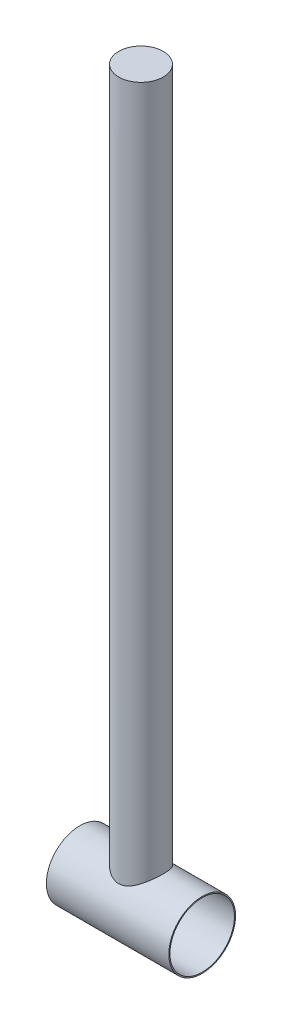
ISO-10303-21;
HEADER;
FILE_DESCRIPTION(('STEP AP214'),'2;1');
FILE_NAME('part.step','',(''),(''),'','','');
FILE_SCHEMA(('AUTOMOTIVE_DESIGN { 1 0 10303 214 1 1 1 1 }'));
ENDSEC;
DATA;
#1=APPLICATION_CONTEXT('core data for automotive mechanical design processes');
#2=APPLICATION_PROTOCOL_DEFINITION('international standard','automotive_design',2000,#1);
#3=PRODUCT_CONTEXT('',#1,'mechanical');
#4=PRODUCT('Part','Part','',(#3));
#5=PRODUCT_RELATED_PRODUCT_CATEGORY('part','',(#4));
#6=PRODUCT_DEFINITION_FORMATION('','',#4);
#7=PRODUCT_DEFINITION_CONTEXT('part definition',#1,'design');
#8=PRODUCT_DEFINITION('design','',#6,#7);
#9=PRODUCT_DEFINITION_SHAPE('','',#8);
#10=(LENGTH_UNIT() NAMED_UNIT(*) SI_UNIT(.MILLI.,.METRE.));
#11=(NAMED_UNIT(*) PLANE_ANGLE_UNIT() SI_UNIT($,.RADIAN.));
#12=(NAMED_UNIT(*) SI_UNIT($,.STERADIAN.) SOLID_ANGLE_UNIT());
#13=UNCERTAINTY_MEASURE_WITH_UNIT(LENGTH_MEASURE(1.E-05),#10,'distance_accuracy_value','');
#14=(GEOMETRIC_REPRESENTATION_CONTEXT(3) GLOBAL_UNCERTAINTY_ASSIGNED_CONTEXT((#13)) GLOBAL_UNIT_ASSIGNED_CONTEXT((#10,
#11,#12)) REPRESENTATION_CONTEXT('',''));
#15=CARTESIAN_POINT('',(0.,0.,0.));
#16=DIRECTION('',(0.,0.,1.));
#17=DIRECTION('',(1.,0.,0.));
#18=AXIS2_PLACEMENT_3D('',#15,#16,#17);
#19=CARTESIAN_POINT('',(55.,0.,0.));
#20=DIRECTION('',(1.,0.,0.));
#21=DIRECTION('',(0.,0.,-1.));
#22=AXIS2_PLACEMENT_3D('',#19,#20,#21);
#23=PLANE('',#22);
#24=CARTESIAN_POINT('',(55.,0.,0.));
#25=DIRECTION('',(1.,0.,0.));
#26=DIRECTION('',(0.,0.,-1.));
#27=AXIS2_PLACEMENT_3D('',#24,#25,#26);
#28=CIRCLE('',#27,30.);
#29=CARTESIAN_POINT('',(55.,0.,-30.));
#30=VERTEX_POINT('',#29);
#31=EDGE_CURVE('E10',#30,#30,#28,.T.);
#32=ORIENTED_EDGE('',*,*,#31,.T.);
#33=EDGE_LOOP('',(#32));
#34=FACE_BOUND('',#33,.T.);
#35=CARTESIAN_POINT('',(55.,0.,0.));
#36=DIRECTION('',(1.,0.,0.));
#37=DIRECTION('',(0.,0.,-1.));
#38=AXIS2_PLACEMENT_3D('',#35,#36,#37);
#39=CIRCLE('',#38,29.);
#40=CARTESIAN_POINT('',(55.,0.,-29.));
#41=VERTEX_POINT('',#40);
#42=EDGE_CURVE('E41',#41,#41,#39,.T.);
#43=ORIENTED_EDGE('',*,*,#42,.F.);
#44=EDGE_LOOP('',(#43));
#45=FACE_BOUND('',#44,.T.);
#46=ADVANCED_FACE('F30',(#34,#45),#23,.T.);
#47=CARTESIAN_POINT('',(-55.,0.,0.));
#48=DIRECTION('',(1.,0.,0.));
#49=DIRECTION('',(0.,0.,-1.));
#50=AXIS2_PLACEMENT_3D('',#47,#48,#49);
#51=PLANE('',#50);
#52=CARTESIAN_POINT('',(-55.,0.,0.));
#53=DIRECTION('',(1.,0.,0.));
#54=DIRECTION('',(0.,0.,-1.));
#55=AXIS2_PLACEMENT_3D('',#52,#53,#54);
#56=CIRCLE('',#55,30.);
#57=CARTESIAN_POINT('',(-55.,0.,-30.));
#58=VERTEX_POINT('',#57);
#59=EDGE_CURVE('E34',#58,#58,#56,.T.);
#60=ORIENTED_EDGE('',*,*,#59,.F.);
#61=EDGE_LOOP('',(#60));
#62=FACE_BOUND('',#61,.T.);
#63=CARTESIAN_POINT('',(-55.,0.,0.));
#64=DIRECTION('',(1.,0.,0.));
#65=DIRECTION('',(0.,0.,-1.));
#66=AXIS2_PLACEMENT_3D('',#63,#64,#65);
#67=CIRCLE('',#66,29.);
#68=CARTESIAN_POINT('',(-55.,0.,-29.));
#69=VERTEX_POINT('',#68);
#70=EDGE_CURVE('E43',#69,#69,#67,.T.);
#71=ORIENTED_EDGE('',*,*,#70,.T.);
#72=EDGE_LOOP('',(#71));
#73=FACE_BOUND('',#72,.T.);
#74=ADVANCED_FACE('F73',(#62,#73),#51,.F.);
#75=CARTESIAN_POINT('',(55.,0.,0.));
#76=DIRECTION('',(-1.,0.,0.));
#77=DIRECTION('',(0.,0.,1.));
#78=AXIS2_PLACEMENT_3D('',#75,#76,#77);
#79=CYLINDRICAL_SURFACE('',#78,30.);
#80=CARTESIAN_POINT('',(0.,22.3606797749979,20.));
#81=CARTESIAN_POINT('',(0.488208956169302,22.3606858935288,19.9999964119226));
#82=CARTESIAN_POINT('',(0.976468291774057,22.3767415723571,19.9820866285813));
#83=CARTESIAN_POINT('',(1.94835881250643,22.4401594085095,19.9108373861768));
#84=CARTESIAN_POINT('',(2.43198924712352,22.4875265581483,19.8574922772833));
#85=CARTESIAN_POINT('',(3.39112332136817,22.6113496939203,19.7163799196857));
#86=CARTESIAN_POINT('',(3.8666135294044,22.6878496694561,19.6285606101056));
#87=CARTESIAN_POINT('',(4.80533737323533,22.8665434498395,19.4200919600602));
#88=CARTESIAN_POINT('',(5.26857077190595,22.9687377513765,19.2994419849513));
#89=CARTESIAN_POINT('',(6.17578513914899,23.193728226989,19.0284426273943));
#90=CARTESIAN_POINT('',(6.61991112961049,23.3163108203906,18.8783985352891));
#91=CARTESIAN_POINT('',(7.49212487931456,23.5787801839215,18.5495380856481));
#92=CARTESIAN_POINT('',(7.92020999413461,23.7186697909934,18.3707170095788));
#93=CARTESIAN_POINT('',(8.75912421482543,24.0118255935988,17.9858478768931));
#94=CARTESIAN_POINT('',(9.16995442032432,24.1650909347959,17.7798015587787));
#95=CARTESIAN_POINT('',(9.97362051230804,24.4813525241294,17.3417522052945));
#96=CARTESIAN_POINT('',(10.3664551510918,24.644349445194,17.1097473739498));
#97=CARTESIAN_POINT('',(11.1932268211757,25.00257367896,16.5827611461459));
#98=CARTESIAN_POINT('',(11.6240409428177,25.1988679806497,16.2835985891376));
#99=CARTESIAN_POINT('',(12.4598274059487,25.5951544496233,15.6533280846079));
#100=CARTESIAN_POINT('',(12.8647979980787,25.7951468660549,15.3222179783466));
#101=CARTESIAN_POINT('',(13.6481434866574,26.194621993879,14.6288076134715));
#102=CARTESIAN_POINT('',(14.0264936382841,26.3941040691864,14.2664790139786));
#103=CARTESIAN_POINT('',(14.7548145893199,26.788258639696,13.5118632099609));
#104=CARTESIAN_POINT('',(15.1047834311923,26.9829308025026,13.1195739425843));
#105=CARTESIAN_POINT('',(15.8231340954399,27.3910931463656,12.2471310095378));
#106=CARTESIAN_POINT('',(16.1868495528045,27.6032288530363,11.7624780965832));
#107=CARTESIAN_POINT('',(16.8717372344808,28.0103500677694,10.7570654072488));
#108=CARTESIAN_POINT('',(17.1929043262227,28.2053335058183,10.2363012863295));
#109=CARTESIAN_POINT('',(17.7887598687195,28.5724511444835,9.16171847148811));
#110=CARTESIAN_POINT('',(18.0634871779264,28.7446044219641,8.60792794262455));
#111=CARTESIAN_POINT('',(18.5627727588207,29.0609568759301,7.47053849984761));
#112=CARTESIAN_POINT('',(18.7873417767955,29.205162039351,6.88694600391359));
#113=CARTESIAN_POINT('',(19.1602240381012,29.4464999554022,5.76165832972234));
#114=CARTESIAN_POINT('',(19.3142641521887,29.5470977395677,5.22260227045827));
#115=CARTESIAN_POINT('',(19.5772038937651,29.7196407127317,4.12906673821279));
#116=CARTESIAN_POINT('',(19.6861065662819,29.7915878345267,3.5745883083375));
#117=CARTESIAN_POINT('',(19.8566974647913,29.904587508942,2.45588842993638));
#118=CARTESIAN_POINT('',(19.9184351137685,29.9456724005222,1.89167781543663));
#119=CARTESIAN_POINT('',(19.9936647349202,29.9957633041667,0.758659088769608));
#120=CARTESIAN_POINT('',(20.007163514351,30.0047738424215,0.189851636642892));
#121=CARTESIAN_POINT('',(19.9873184370662,29.9915473981852,-0.859806415927929));
#122=CARTESIAN_POINT('',(19.9607940358833,29.9738593639155,-1.34086232409545));
#123=CARTESIAN_POINT('',(19.873310019839,29.9156709892741,-2.2983895351906));
#124=CARTESIAN_POINT('',(19.8123548499873,29.8751735935912,-2.7748614218412));
#125=CARTESIAN_POINT('',(19.6568520909165,29.7722764488344,-3.7198828753724));
#126=CARTESIAN_POINT('',(19.5623030441721,29.7098757494512,-4.18843209759108));
#127=CARTESIAN_POINT('',(19.3408382238798,29.5645234505635,-5.11455664152083));
#128=CARTESIAN_POINT('',(19.2139210515152,29.4815709628999,-5.57213148802944));
#129=CARTESIAN_POINT('',(18.9298040334638,29.2971987002846,-6.47179810816159));
#130=CARTESIAN_POINT('',(18.7727295883957,29.1958554904912,-6.91394533614488));
#131=CARTESIAN_POINT('',(18.4296096664266,28.9764235265008,-7.78251525709052));
#132=CARTESIAN_POINT('',(18.2435647019401,28.858335068488,-8.20893822800989));
#133=CARTESIAN_POINT('',(17.8441778455769,28.6075257726395,-9.04431763466509));
#134=CARTESIAN_POINT('',(17.6308352556287,28.4748045606182,-9.45327362336784));
#135=CARTESIAN_POINT('',(17.1784769804029,28.1969539999433,-10.2523545489443));
#136=CARTESIAN_POINT('',(16.9394582795807,28.0518231942476,-10.6424772661187));
#137=CARTESIAN_POINT('',(16.4042840153249,27.7317267401802,-11.4527356062426));
#138=CARTESIAN_POINT('',(16.1047473885238,27.5553463717531,-11.8700812163928));
#139=CARTESIAN_POINT('',(15.4767499308217,27.1930871485775,-12.6780149842778));
#140=CARTESIAN_POINT('',(15.1482869484778,27.007207587744,-13.0686011478891));
#141=CARTESIAN_POINT('',(14.463625347029,26.6292105400492,-13.8225619123957));
#142=CARTESIAN_POINT('',(14.107387635318,26.4370844912714,-14.185896693865));
#143=CARTESIAN_POINT('',(13.3689696755022,26.0505351068054,-14.883843396687));
#144=CARTESIAN_POINT('',(12.9867881329827,25.8561116568934,-15.2184538830105));
#145=CARTESIAN_POINT('',(12.1362208652914,25.4387487342262,-15.9077512722913));
#146=CARTESIAN_POINT('',(11.6636681752519,25.2160728404677,-16.2574779985587));
#147=CARTESIAN_POINT('',(10.6867448691347,24.7793365815512,-16.9156894234147));
#148=CARTESIAN_POINT('',(10.1823671315698,24.5652781624035,-17.2241648426868));
#149=CARTESIAN_POINT('',(9.14376134489058,24.1532936665152,-17.7972680129957));
#150=CARTESIAN_POINT('',(8.60957393087465,23.9553464914574,-18.0619535936899));
#151=CARTESIAN_POINT('',(7.78719238261372,23.6764424287916,-18.4241508744694));
#152=CARTESIAN_POINT('',(7.50958963683993,23.586488758667,-18.539064186288));
#153=CARTESIAN_POINT('',(6.9474950398416,23.4135888725702,-18.7569503816948));
#154=CARTESIAN_POINT('',(6.66300152644,23.3306443694362,-18.8599203489511));
#155=CARTESIAN_POINT('',(5.96407091868975,23.1390114191645,-19.0949737019528));
#156=CARTESIAN_POINT('',(5.54626140545961,23.0345499403737,-19.2205883140043));
#157=CARTESIAN_POINT('',(4.69922231908342,22.8454014192454,-19.4450303060951));
#158=CARTESIAN_POINT('',(4.26999589657128,22.7607089831938,-19.5438649938583));
#159=CARTESIAN_POINT('',(3.40278811100768,22.6140815263718,-19.7133430846625));
#160=CARTESIAN_POINT('',(2.96482019952331,22.5521140132966,-19.78402675084));
#161=CARTESIAN_POINT('',(2.08233638909669,22.4531500088269,-19.8962732778957));
#162=CARTESIAN_POINT('',(1.63782046369869,22.4161536183507,-19.9378360210846));
#163=CARTESIAN_POINT('',(0.743602003114599,22.3685666502113,-19.9912114344644));
#164=CARTESIAN_POINT('',(0.293885240116608,22.3580932385861,-20.0028921020166));
#165=CARTESIAN_POINT('',(-0.605120297999122,22.3643493087133,-19.9958970388908));
#166=CARTESIAN_POINT('',(-1.05440907208808,22.381078855691,-19.9772212354264));
#167=CARTESIAN_POINT('',(-1.94924286023368,22.4410353821841,-19.9098452800438));
#168=CARTESIAN_POINT('',(-2.39478497674718,22.4842812448844,-19.8611237313693));
#169=CARTESIAN_POINT('',(-3.27854030433161,22.5954993646352,-19.7344995148557));
#170=CARTESIAN_POINT('',(-3.71675339276234,22.6634720350192,-19.6565963592159));
#171=CARTESIAN_POINT('',(-4.56177482159981,22.8176625120601,-19.4773587360434));
#172=CARTESIAN_POINT('',(-4.96906636618389,22.9028156744357,-19.3773687153742));
#173=CARTESIAN_POINT('',(-5.77297690486428,23.0905696500378,-19.1532490632813));
#174=CARTESIAN_POINT('',(-6.16959170710485,23.193177203668,-19.0291101035355));
#175=CARTESIAN_POINT('',(-6.95065639455213,23.4130553221982,-18.7579126655137));
#176=CARTESIAN_POINT('',(-7.33510717762388,23.5303248016759,-18.6108558836455));
#177=CARTESIAN_POINT('',(-8.09100392305639,23.7768089487606,-18.2949037795793));
#178=CARTESIAN_POINT('',(-8.46244798787663,23.9060253493674,-18.1260052876392));
#179=CARTESIAN_POINT('',(-9.26453201163454,24.2005356466709,-17.731501269301));
#180=CARTESIAN_POINT('',(-9.69216720830646,24.3678787987211,-17.5013086005028));
#181=CARTESIAN_POINT('',(-10.5268797585094,24.7117489529602,-17.0123139239897));
#182=CARTESIAN_POINT('',(-10.9339551810085,24.8882768146534,-16.7535092362064));
#183=CARTESIAN_POINT('',(-11.7272393872388,25.246838016415,-16.2081390990384));
#184=CARTESIAN_POINT('',(-12.1134251136209,25.4288771074695,-15.9215439116551));
#185=CARTESIAN_POINT('',(-12.8636865056439,25.7947122322757,-15.3217576930428));
#186=CARTESIAN_POINT('',(-13.2277606863969,25.9785083830645,-15.0085648790455));
#187=CARTESIAN_POINT('',(-14.010022924438,26.3845748584298,-14.2850209466698));
#188=CARTESIAN_POINT('',(-14.4226354817809,26.6064699077529,-13.868399953091));
#189=CARTESIAN_POINT('',(-15.2116275793937,27.0422910024591,-12.9981303927617));
#190=CARTESIAN_POINT('',(-15.5880004523266,27.2562155770218,-12.5444750407321));
#191=CARTESIAN_POINT('',(-16.3015809622043,27.6705120036506,-11.6020484650165));
#192=CARTESIAN_POINT('',(-16.6388155779588,27.8708931512095,-11.1133018111967));
#193=CARTESIAN_POINT('',(-17.2712189380549,28.2529916116302,-10.1024838029969));
#194=CARTESIAN_POINT('',(-17.5663989619658,28.4347139253593,-9.58042143890715));
#195=CARTESIAN_POINT('',(-18.0588559388184,28.7418292040784,-8.60898698059618));
#196=CARTESIAN_POINT('',(-18.2640476187588,28.871337394815,-8.16491313347025));
#197=CARTESIAN_POINT('',(-18.6427436665588,29.11237793097,-7.25872966066565));
#198=CARTESIAN_POINT('',(-18.8162516453839,29.2239123246767,-6.79662209756984));
#199=CARTESIAN_POINT('',(-19.1295452645596,29.4266077341683,-5.85709265439532));
#200=CARTESIAN_POINT('',(-19.2693535082187,29.5177824027246,-5.37968128385404));
#201=CARTESIAN_POINT('',(-19.5136219644057,29.6778186712604,-4.41219358714589));
#202=CARTESIAN_POINT('',(-19.6180816641359,29.746679947541,-3.92211707735809));
#203=CARTESIAN_POINT('',(-19.7905605262366,29.8607111976658,-2.93054121015945));
#204=CARTESIAN_POINT('',(-19.8584133272705,29.9057729947659,-2.42900032455901));
#205=CARTESIAN_POINT('',(-19.9559150035461,29.9706058238814,-1.42057881685206));
#206=CARTESIAN_POINT('',(-19.985563818304,29.990376815857,-0.913698186293028));
#207=CARTESIAN_POINT('',(-20.0061827922548,30.0041212399487,0.101169392531045));
#208=CARTESIAN_POINT('',(-19.9971552556599,29.9980962089087,0.609156273087099));
#209=CARTESIAN_POINT('',(-19.9405705458765,29.9604056252688,1.6219998853204));
#210=CARTESIAN_POINT('',(-19.8930151261764,29.9287412395721,2.12685675839747));
#211=CARTESIAN_POINT('',(-19.7649794259347,29.8437985658208,3.09279975247603));
#212=CARTESIAN_POINT('',(-19.687150146037,29.7922629250282,3.55439520403422));
#213=CARTESIAN_POINT('',(-19.5000321223317,29.6689450523963,4.46836902451357));
#214=CARTESIAN_POINT('',(-19.3907452072019,29.597163997457,4.92074792756968));
#215=CARTESIAN_POINT('',(-19.1419956701691,29.4347944617127,5.81367709229975));
#216=CARTESIAN_POINT('',(-19.0025311498945,29.344204797736,6.25422660786601));
#217=CARTESIAN_POINT('',(-18.6949126651676,29.1459419809342,7.12122590088721));
#218=CARTESIAN_POINT('',(-18.5267571866793,29.0382679265783,7.54767493283413));
#219=CARTESIAN_POINT('',(-18.1528283168398,28.8010951909527,8.40878779714675));
#220=CARTESIAN_POINT('',(-17.9454426246028,28.670694888708,8.84250227551098));
#221=CARTESIAN_POINT('',(-17.5022026754717,28.3953682076704,9.69029143409239));
#222=CARTESIAN_POINT('',(-17.2663476127158,28.2504414177065,10.104365557902));
#223=CARTESIAN_POINT('',(-16.7678351398796,27.9485407408145,10.9116855558948));
#224=CARTESIAN_POINT('',(-16.5051663004555,27.7915617237644,11.3049224388242));
#225=CARTESIAN_POINT('',(-15.9547049296104,27.4682178656632,12.0693531593152));
#226=CARTESIAN_POINT('',(-15.6669095826824,27.3018519735229,12.4405445187535));
#227=CARTESIAN_POINT('',(-15.0204704992175,26.9357159197241,13.2166207315212));
#228=CARTESIAN_POINT('',(-14.6578028483683,26.7348072575091,13.6176230440809));
#229=CARTESIAN_POINT('',(-13.9025385930368,26.3282976577339,14.3878567191196));
#230=CARTESIAN_POINT('',(-13.5099380886709,26.1226961112019,14.757083928306));
#231=CARTESIAN_POINT('',(-12.6960054650691,25.7111873767681,15.4629181005339));
#232=CARTESIAN_POINT('',(-12.2746525915669,25.5052800753153,15.7995010665117));
#233=CARTESIAN_POINT('',(-11.4046784566367,25.0981854077811,16.4385088149114));
#234=CARTESIAN_POINT('',(-10.9560598425279,24.8969975860907,16.7409369054171));
#235=CARTESIAN_POINT('',(-10.0678167363029,24.519622725546,17.288437587054));
#236=CARTESIAN_POINT('',(-9.63011792851658,24.3426994009277,17.536125801145));
#237=CARTESIAN_POINT('',(-8.7331555306482,24.0019984692107,17.9996334824726));
#238=CARTESIAN_POINT('',(-8.2738912921484,23.838221257784,18.2154519906584));
#239=CARTESIAN_POINT('',(-7.33576452239175,23.5290813254498,18.6130511835398));
#240=CARTESIAN_POINT('',(-6.8569347106357,23.3836894022856,18.7948860714089));
#241=CARTESIAN_POINT('',(-5.8808384596528,23.1163199010043,19.1227764985235));
#242=CARTESIAN_POINT('',(-5.38357708340434,22.9943359489798,19.268841780706));
#243=CARTESIAN_POINT('',(-4.4853911912487,22.802875861737,19.4947592055363));
#244=CARTESIAN_POINT('',(-4.0875446783002,22.7277543004783,19.5821115045836));
#245=CARTESIAN_POINT('',(-3.28415884670264,22.5970955375622,19.7327455746581));
#246=CARTESIAN_POINT('',(-2.8786207162801,22.541555336465,19.7960310323203));
#247=CARTESIAN_POINT('',(-2.06234621278792,22.4519236803042,19.8976315087765));
#248=CARTESIAN_POINT('',(-1.65161370745006,22.4178171262643,19.9359641063474));
#249=CARTESIAN_POINT('',(-0.827266419755446,22.3721912092578,19.9871514199303));
#250=CARTESIAN_POINT('',(-0.413651293298562,22.3606745908688,20.0000030401181));
#251=CARTESIAN_POINT('',(0.,22.3606797749979,20.));
#252=B_SPLINE_CURVE_WITH_KNOTS('',3,(#80,#81,#82,#83,#84,#85,#86,#87,#88,#89,#90,#91,#92,#93,
#94,#95,#96,#97,#98,#99,#100,#101,#102,#103,#104,#105,#106,#107,#108,#109,#110,#111,#112,#113,
#114,#115,#116,#117,#118,#119,#120,#121,#122,#123,#124,#125,#126,#127,#128,#129,#130,#131,#132,
#133,#134,#135,#136,#137,#138,#139,#140,#141,#142,#143,#144,#145,#146,#147,#148,#149,#150,#151,
#152,#153,#154,#155,#156,#157,#158,#159,#160,#161,#162,#163,#164,#165,#166,#167,#168,#169,#170,
#171,#172,#173,#174,#175,#176,#177,#178,#179,#180,#181,#182,#183,#184,#185,#186,#187,#188,#189,
#190,#191,#192,#193,#194,#195,#196,#197,#198,#199,#200,#201,#202,#203,#204,#205,#206,#207,#208,
#209,#210,#211,#212,#213,#214,#215,#216,#217,#218,#219,#220,#221,#222,#223,#224,#225,#226,#227,
#228,#229,#230,#231,#232,#233,#234,#235,#236,#237,#238,#239,#240,#241,#242,#243,#244,#245,#246,
#247,#248,#249,#250,#251),.UNSPECIFIED.,.T.,.F.,(4,2,2,2,2,2,2,2,2,2,2,2,2,2,2,2,2,2,2,2,2,2,2,
2,2,2,2,2,2,2,2,2,2,2,2,2,2,2,2,2,2,2,2,2,2,2,2,2,2,2,2,2,2,2,2,2,2,2,2,2,2,2,2,2,2,2,2,2,2,2,2,
2,2,2,2,2,2,2,2,2,2,2,2,2,2,4),(0.,1.46413383476119,2.92850116798433,4.3950884612604,
5.86170410688106,7.31382579475252,8.76618582863998,10.2184531650401,11.6708210407287,
13.3493094048912,15.0279112663608,16.7080533902126,18.3883112996803,20.3117642438544,
22.2354490015051,24.1575160629544,26.0791709305319,27.7853619359246,29.4914378208096,
31.1957234922768,32.8997686529781,34.3443503382155,35.7887455706705,37.2332034782288,
38.6777238198782,40.1163627603301,41.5549762578204,42.9936265517613,44.4324459938663,
46.0602839475324,47.6882430766068,49.3185364037738,50.9489111309837,52.8326361759336,
54.7167842470655,56.5984238649026,57.5389749114896,58.4797551409555,59.8242529017226,
61.1683834046849,62.5105844944299,63.8527910085193,65.2009164973756,66.5490452186684,
67.8981351058559,69.2472475454816,70.529851328563,71.8129515469024,73.0959568335221,
74.3791485235474,75.9187799981372,77.4585558113539,78.9999978795721,80.5415433482356,
82.4201756779316,84.2991529785492,86.1768272700558,88.053996993814,89.5706110260009,
91.0870521029024,92.6024732144332,94.1179163090846,95.6401895843999,97.1624652697504,
98.6846502640926,100.206765984357,101.617993966733,103.029139928947,104.440374687427,
105.851683940514,107.344548709883,108.837455746597,110.331001811733,111.824715448892,
113.553354854051,115.282219865862,117.012346298594,118.742305015278,120.340261559248,
121.93826618052,123.53369984988,125.128698469926,126.370149556428,127.611410396842,
128.85179584545,130.092331986087),.UNSPECIFIED.);
#253=CARTESIAN_POINT('',(0.,22.3606797749979,20.));
#254=VERTEX_POINT('',#253);
#255=EDGE_CURVE('E46',#254,#254,#252,.T.);
#256=ORIENTED_EDGE('',*,*,#255,.F.);
#257=EDGE_LOOP('',(#256));
#258=FACE_BOUND('',#257,.T.);
#259=ORIENTED_EDGE('',*,*,#31,.F.);
#260=EDGE_LOOP('',(#259));
#261=FACE_BOUND('',#260,.T.);
#262=ORIENTED_EDGE('',*,*,#59,.T.);
#263=EDGE_LOOP('',(#262));
#264=FACE_BOUND('',#263,.T.);
#265=ADVANCED_FACE('F32',(#258,#261,#264),#79,.T.);
#266=CARTESIAN_POINT('',(55.,0.,0.));
#267=DIRECTION('',(-1.,0.,0.));
#268=DIRECTION('',(0.,0.,1.));
#269=AXIS2_PLACEMENT_3D('',#266,#267,#268);
#270=CYLINDRICAL_SURFACE('',#269,29.);
#271=ORIENTED_EDGE('',*,*,#42,.T.);
#272=EDGE_LOOP('',(#271));
#273=FACE_BOUND('',#272,.T.);
#274=ORIENTED_EDGE('',*,*,#70,.F.);
#275=EDGE_LOOP('',(#274));
#276=FACE_BOUND('',#275,.T.);
#277=ADVANCED_FACE('F63',(#273,#276),#270,.F.);
#278=CARTESIAN_POINT('',(0.,650.,0.));
#279=DIRECTION('',(0.,1.,0.));
#280=DIRECTION('',(0.,0.,1.));
#281=AXIS2_PLACEMENT_3D('',#278,#279,#280);
#282=PLANE('',#281);
#283=CARTESIAN_POINT('',(0.,650.,0.));
#284=DIRECTION('',(0.,1.,0.));
#285=DIRECTION('',(0.,0.,1.));
#286=AXIS2_PLACEMENT_3D('',#283,#284,#285);
#287=CIRCLE('',#286,20.);
#288=CARTESIAN_POINT('',(0.,650.,20.));
#289=VERTEX_POINT('',#288);
#290=EDGE_CURVE('E55',#289,#289,#287,.T.);
#291=ORIENTED_EDGE('',*,*,#290,.T.);
#292=EDGE_LOOP('',(#291));
#293=FACE_BOUND('',#292,.T.);
#294=ADVANCED_FACE('F61',(#293),#282,.T.);
#295=CARTESIAN_POINT('',(0.,-30.0010000000001,0.));
#296=DIRECTION('',(0.,1.,0.));
#297=DIRECTION('',(0.,0.,1.));
#298=AXIS2_PLACEMENT_3D('',#295,#296,#297);
#299=CYLINDRICAL_SURFACE('',#298,20.);
#300=ORIENTED_EDGE('',*,*,#290,.F.);
#301=EDGE_LOOP('',(#300));
#302=FACE_BOUND('',#301,.T.);
#303=ORIENTED_EDGE('',*,*,#255,.T.);
#304=EDGE_LOOP('',(#303));
#305=FACE_BOUND('',#304,.T.);
#306=ADVANCED_FACE('F56',(#302,#305),#299,.T.);
#307=CLOSED_SHELL('',(#46,#74,#265,#277,#294,#306));
#308=MANIFOLD_SOLID_BREP('B2',#307);
#309=ADVANCED_BREP_SHAPE_REPRESENTATION('',(#18,#308),#14);
#310=SHAPE_DEFINITION_REPRESENTATION(#9,#309);
ENDSEC;
END-ISO-10303-21;
